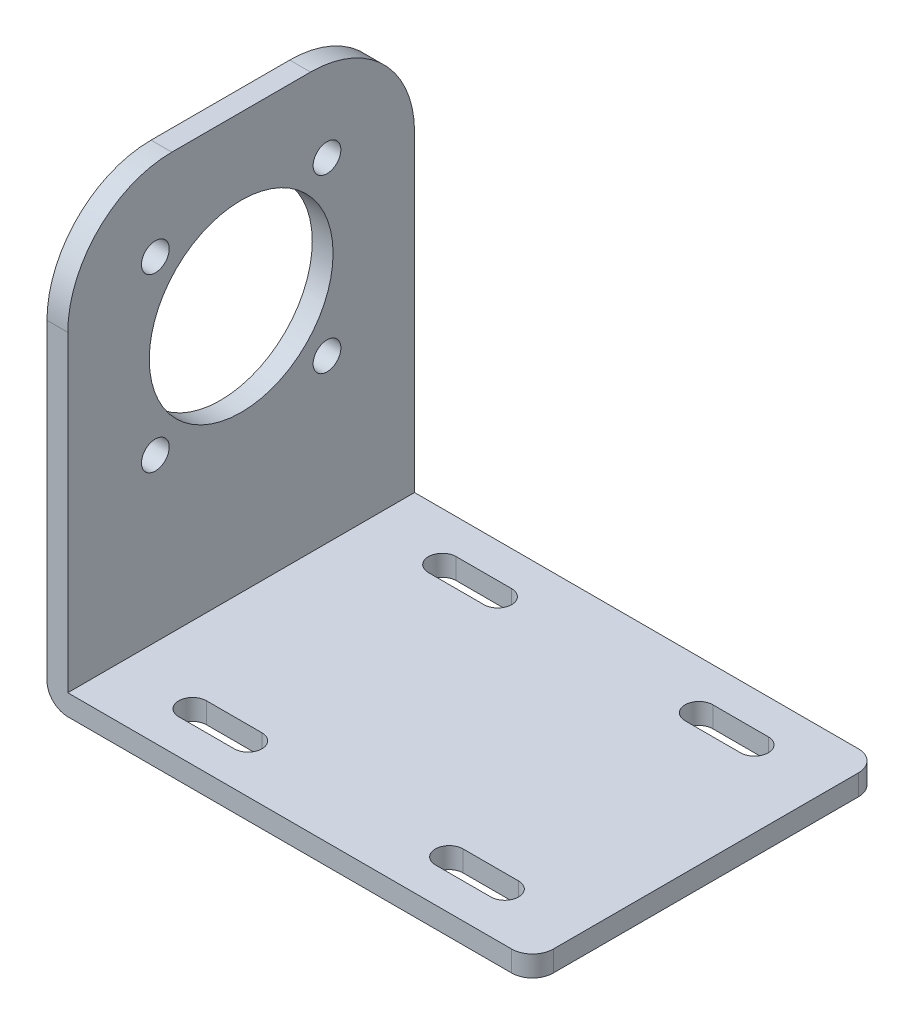
ISO-10303-21;
HEADER;
FILE_DESCRIPTION(('STEP AP214'),'2;1');
FILE_NAME('part.step','',(''),(''),'','','');
FILE_SCHEMA(('AUTOMOTIVE_DESIGN { 1 0 10303 214 1 1 1 1 }'));
ENDSEC;
DATA;
#1=APPLICATION_CONTEXT('core data for automotive mechanical design processes');
#2=APPLICATION_PROTOCOL_DEFINITION('international standard','automotive_design',2000,#1);
#3=PRODUCT_CONTEXT('',#1,'mechanical');
#4=PRODUCT('Part','Part','',(#3));
#5=PRODUCT_RELATED_PRODUCT_CATEGORY('part','',(#4));
#6=PRODUCT_DEFINITION_FORMATION('','',#4);
#7=PRODUCT_DEFINITION_CONTEXT('part definition',#1,'design');
#8=PRODUCT_DEFINITION('design','',#6,#7);
#9=PRODUCT_DEFINITION_SHAPE('','',#8);
#10=(LENGTH_UNIT() NAMED_UNIT(*) SI_UNIT(.MILLI.,.METRE.));
#11=(NAMED_UNIT(*) PLANE_ANGLE_UNIT() SI_UNIT($,.RADIAN.));
#12=(NAMED_UNIT(*) SI_UNIT($,.STERADIAN.) SOLID_ANGLE_UNIT());
#13=UNCERTAINTY_MEASURE_WITH_UNIT(LENGTH_MEASURE(1.E-05),#10,'distance_accuracy_value','');
#14=(GEOMETRIC_REPRESENTATION_CONTEXT(3) GLOBAL_UNCERTAINTY_ASSIGNED_CONTEXT((#13)) GLOBAL_UNIT_ASSIGNED_CONTEXT((#10,
#11,#12)) REPRESENTATION_CONTEXT('',''));
#15=CARTESIAN_POINT('',(0.,0.,0.));
#16=DIRECTION('',(0.,0.,1.));
#17=DIRECTION('',(1.,0.,0.));
#18=AXIS2_PLACEMENT_3D('',#15,#16,#17);
#19=CARTESIAN_POINT('',(0.,3.,0.));
#20=DIRECTION('',(0.,-1.,0.));
#21=DIRECTION('',(0.,0.,-1.));
#22=AXIS2_PLACEMENT_3D('',#19,#20,#21);
#23=PLANE('',#22);
#24=CARTESIAN_POINT('',(14.,3.,-6.99999999999999));
#25=DIRECTION('',(0.,1.,0.));
#26=DIRECTION('',(0.,0.,-1.));
#27=AXIS2_PLACEMENT_3D('',#24,#25,#26);
#28=CIRCLE('',#27,2.00000000000001);
#29=CARTESIAN_POINT('',(14.,3.,-9.));
#30=VERTEX_POINT('',#29);
#31=CARTESIAN_POINT('',(14.,3.,-4.99999999999998));
#32=VERTEX_POINT('',#31);
#33=EDGE_CURVE('E290',#30,#32,#28,.T.);
#34=ORIENTED_EDGE('',*,*,#33,.F.);
#35=DIRECTION('',(-1.,0.,0.));
#36=VECTOR('',#35,1.);
#37=CARTESIAN_POINT('',(14.,3.,-9.));
#38=LINE('',#37,#36);
#39=CARTESIAN_POINT('',(22.,3.,-8.99999999999999));
#40=VERTEX_POINT('',#39);
#41=EDGE_CURVE('E301',#40,#30,#38,.T.);
#42=ORIENTED_EDGE('',*,*,#41,.F.);
#43=CARTESIAN_POINT('',(22.,3.,-6.99999999999999));
#44=DIRECTION('',(0.,1.,0.));
#45=DIRECTION('',(0.,0.,-1.));
#46=AXIS2_PLACEMENT_3D('',#43,#44,#45);
#47=CIRCLE('',#46,1.99999999999999);
#48=CARTESIAN_POINT('',(22.,3.,-5.));
#49=VERTEX_POINT('',#48);
#50=EDGE_CURVE('E297',#49,#40,#47,.T.);
#51=ORIENTED_EDGE('',*,*,#50,.F.);
#52=DIRECTION('',(1.,0.,0.));
#53=VECTOR('',#52,1.);
#54=CARTESIAN_POINT('',(14.,3.,-4.99999999999998));
#55=LINE('',#54,#53);
#56=EDGE_CURVE('E293',#32,#49,#55,.T.);
#57=ORIENTED_EDGE('',*,*,#56,.F.);
#58=EDGE_LOOP('',(#34,#42,#51,#57));
#59=FACE_BOUND('',#58,.T.);
#60=CARTESIAN_POINT('',(51.,3.,-43.));
#61=DIRECTION('',(0.,1.,0.));
#62=DIRECTION('',(0.,0.,1.));
#63=AXIS2_PLACEMENT_3D('',#60,#61,#62);
#64=CIRCLE('',#63,1.99999999999999);
#65=CARTESIAN_POINT('',(51.,3.,-45.));
#66=VERTEX_POINT('',#65);
#67=CARTESIAN_POINT('',(51.,3.,-41.));
#68=VERTEX_POINT('',#67);
#69=EDGE_CURVE('E376',#66,#68,#64,.T.);
#70=ORIENTED_EDGE('',*,*,#69,.F.);
#71=DIRECTION('',(-1.,0.,0.));
#72=VECTOR('',#71,1.);
#73=CARTESIAN_POINT('',(51.,3.,-45.));
#74=LINE('',#73,#72);
#75=CARTESIAN_POINT('',(59.,3.,-45.));
#76=VERTEX_POINT('',#75);
#77=EDGE_CURVE('E387',#76,#66,#74,.T.);
#78=ORIENTED_EDGE('',*,*,#77,.F.);
#79=CARTESIAN_POINT('',(59.,3.,-43.));
#80=DIRECTION('',(0.,1.,0.));
#81=DIRECTION('',(0.,0.,1.));
#82=AXIS2_PLACEMENT_3D('',#79,#80,#81);
#83=CIRCLE('',#82,2.00000000000001);
#84=CARTESIAN_POINT('',(59.,3.,-41.));
#85=VERTEX_POINT('',#84);
#86=EDGE_CURVE('E383',#85,#76,#83,.T.);
#87=ORIENTED_EDGE('',*,*,#86,.F.);
#88=DIRECTION('',(1.,0.,0.));
#89=VECTOR('',#88,1.);
#90=CARTESIAN_POINT('',(51.,3.,-41.));
#91=LINE('',#90,#89);
#92=EDGE_CURVE('E379',#68,#85,#91,.T.);
#93=ORIENTED_EDGE('',*,*,#92,.F.);
#94=EDGE_LOOP('',(#70,#78,#87,#93));
#95=FACE_BOUND('',#94,.T.);
#96=CARTESIAN_POINT('',(14.,3.,-43.));
#97=DIRECTION('',(0.,1.,0.));
#98=DIRECTION('',(0.,0.,1.));
#99=AXIS2_PLACEMENT_3D('',#96,#97,#98);
#100=CIRCLE('',#99,2.00000000000001);
#101=CARTESIAN_POINT('',(14.,3.,-45.));
#102=VERTEX_POINT('',#101);
#103=CARTESIAN_POINT('',(14.,3.,-41.));
#104=VERTEX_POINT('',#103);
#105=EDGE_CURVE('E419',#102,#104,#100,.T.);
#106=ORIENTED_EDGE('',*,*,#105,.F.);
#107=DIRECTION('',(-1.,0.,0.));
#108=VECTOR('',#107,1.);
#109=CARTESIAN_POINT('',(14.,3.,-45.));
#110=LINE('',#109,#108);
#111=CARTESIAN_POINT('',(22.,3.,-45.));
#112=VERTEX_POINT('',#111);
#113=EDGE_CURVE('E430',#112,#102,#110,.T.);
#114=ORIENTED_EDGE('',*,*,#113,.F.);
#115=CARTESIAN_POINT('',(22.,3.,-43.));
#116=DIRECTION('',(0.,1.,0.));
#117=DIRECTION('',(0.,0.,1.));
#118=AXIS2_PLACEMENT_3D('',#115,#116,#117);
#119=CIRCLE('',#118,1.99999999999999);
#120=CARTESIAN_POINT('',(22.,3.,-41.));
#121=VERTEX_POINT('',#120);
#122=EDGE_CURVE('E426',#121,#112,#119,.T.);
#123=ORIENTED_EDGE('',*,*,#122,.F.);
#124=DIRECTION('',(1.,0.,0.));
#125=VECTOR('',#124,1.);
#126=CARTESIAN_POINT('',(14.,3.,-41.));
#127=LINE('',#126,#125);
#128=EDGE_CURVE('E422',#104,#121,#127,.T.);
#129=ORIENTED_EDGE('',*,*,#128,.F.);
#130=EDGE_LOOP('',(#106,#114,#123,#129));
#131=FACE_BOUND('',#130,.T.);
#132=CARTESIAN_POINT('',(51.,3.,-6.99999999999999));
#133=DIRECTION('',(0.,1.,0.));
#134=DIRECTION('',(0.,0.,-1.));
#135=AXIS2_PLACEMENT_3D('',#132,#133,#134);
#136=CIRCLE('',#135,1.99999999999999);
#137=CARTESIAN_POINT('',(51.,3.,-8.99999999999999));
#138=VERTEX_POINT('',#137);
#139=CARTESIAN_POINT('',(51.,3.,-5.));
#140=VERTEX_POINT('',#139);
#141=EDGE_CURVE('E333',#138,#140,#136,.T.);
#142=ORIENTED_EDGE('',*,*,#141,.F.);
#143=DIRECTION('',(-1.,0.,0.));
#144=VECTOR('',#143,1.);
#145=CARTESIAN_POINT('',(51.,3.,-8.99999999999999));
#146=LINE('',#145,#144);
#147=CARTESIAN_POINT('',(59.,3.,-9.));
#148=VERTEX_POINT('',#147);
#149=EDGE_CURVE('E344',#148,#138,#146,.T.);
#150=ORIENTED_EDGE('',*,*,#149,.F.);
#151=CARTESIAN_POINT('',(59.,3.,-6.99999999999999));
#152=DIRECTION('',(0.,1.,0.));
#153=DIRECTION('',(0.,0.,-1.));
#154=AXIS2_PLACEMENT_3D('',#151,#152,#153);
#155=CIRCLE('',#154,2.00000000000001);
#156=CARTESIAN_POINT('',(59.,3.,-4.99999999999998));
#157=VERTEX_POINT('',#156);
#158=EDGE_CURVE('E340',#157,#148,#155,.T.);
#159=ORIENTED_EDGE('',*,*,#158,.F.);
#160=DIRECTION('',(1.,0.,0.));
#161=VECTOR('',#160,1.);
#162=CARTESIAN_POINT('',(51.,3.,-5.));
#163=LINE('',#162,#161);
#164=EDGE_CURVE('E336',#140,#157,#163,.T.);
#165=ORIENTED_EDGE('',*,*,#164,.F.);
#166=EDGE_LOOP('',(#142,#150,#159,#165));
#167=FACE_BOUND('',#166,.T.);
#168=DIRECTION('',(1.,0.,0.));
#169=VECTOR('',#168,1.);
#170=CARTESIAN_POINT('',(0.,3.,0.));
#171=LINE('',#170,#169);
#172=CARTESIAN_POINT('',(3.,3.,0.));
#173=VERTEX_POINT('',#172);
#174=CARTESIAN_POINT('',(67.,3.,0.));
#175=VERTEX_POINT('',#174);
#176=EDGE_CURVE('E462',#173,#175,#171,.T.);
#177=ORIENTED_EDGE('',*,*,#176,.T.);
#178=CARTESIAN_POINT('',(67.,3.,-3.));
#179=DIRECTION('',(0.,-1.,0.));
#180=DIRECTION('',(0.,0.,-1.));
#181=AXIS2_PLACEMENT_3D('',#178,#179,#180);
#182=CIRCLE('',#181,3.);
#183=CARTESIAN_POINT('',(70.,3.,-3.));
#184=VERTEX_POINT('',#183);
#185=EDGE_CURVE('E12',#175,#184,#182,.F.);
#186=ORIENTED_EDGE('',*,*,#185,.T.);
#187=DIRECTION('',(0.,0.,-1.));
#188=VECTOR('',#187,1.);
#189=CARTESIAN_POINT('',(70.,3.,0.));
#190=LINE('',#189,#188);
#191=CARTESIAN_POINT('',(70.,3.,-47.));
#192=VERTEX_POINT('',#191);
#193=EDGE_CURVE('E257',#184,#192,#190,.T.);
#194=ORIENTED_EDGE('',*,*,#193,.T.);
#195=CARTESIAN_POINT('',(67.,3.,-47.));
#196=DIRECTION('',(0.,-1.,0.));
#197=DIRECTION('',(0.,0.,-1.));
#198=AXIS2_PLACEMENT_3D('',#195,#196,#197);
#199=CIRCLE('',#198,3.);
#200=CARTESIAN_POINT('',(67.,3.,-50.));
#201=VERTEX_POINT('',#200);
#202=EDGE_CURVE('E76',#192,#201,#199,.F.);
#203=ORIENTED_EDGE('',*,*,#202,.T.);
#204=DIRECTION('',(-1.,0.,0.));
#205=VECTOR('',#204,1.);
#206=CARTESIAN_POINT('',(0.,3.,-50.));
#207=LINE('',#206,#205);
#208=CARTESIAN_POINT('',(3.,3.,-50.));
#209=VERTEX_POINT('',#208);
#210=EDGE_CURVE('E246',#201,#209,#207,.T.);
#211=ORIENTED_EDGE('',*,*,#210,.T.);
#212=DIRECTION('',(0.,0.,-1.));
#213=VECTOR('',#212,1.);
#214=CARTESIAN_POINT('',(3.,3.,-50.));
#215=LINE('',#214,#213);
#216=EDGE_CURVE('E249',#173,#209,#215,.T.);
#217=ORIENTED_EDGE('',*,*,#216,.F.);
#218=EDGE_LOOP('',(#177,#186,#194,#203,#211,#217));
#219=FACE_BOUND('',#218,.T.);
#220=ADVANCED_FACE('F67',(#59,#95,#131,#167,#219),#23,.F.);
#221=CARTESIAN_POINT('',(0.,0.,0.));
#222=DIRECTION('',(0.,-1.,0.));
#223=DIRECTION('',(0.,0.,-1.));
#224=AXIS2_PLACEMENT_3D('',#221,#222,#223);
#225=PLANE('',#224);
#226=DIRECTION('',(1.,0.,0.));
#227=VECTOR('',#226,1.);
#228=CARTESIAN_POINT('',(0.,0.,0.));
#229=LINE('',#228,#227);
#230=CARTESIAN_POINT('',(3.,0.,0.));
#231=VERTEX_POINT('',#230);
#232=CARTESIAN_POINT('',(67.,0.,0.));
#233=VERTEX_POINT('',#232);
#234=EDGE_CURVE('E461',#231,#233,#229,.T.);
#235=ORIENTED_EDGE('',*,*,#234,.F.);
#236=DIRECTION('',(0.,0.,1.));
#237=VECTOR('',#236,1.);
#238=CARTESIAN_POINT('',(3.,0.,-50.));
#239=LINE('',#238,#237);
#240=CARTESIAN_POINT('',(3.,0.,-50.));
#241=VERTEX_POINT('',#240);
#242=EDGE_CURVE('E540',#231,#241,#239,.F.);
#243=ORIENTED_EDGE('',*,*,#242,.T.);
#244=DIRECTION('',(-1.,0.,0.));
#245=VECTOR('',#244,1.);
#246=CARTESIAN_POINT('',(0.,0.,-50.));
#247=LINE('',#246,#245);
#248=CARTESIAN_POINT('',(67.,0.,-50.));
#249=VERTEX_POINT('',#248);
#250=EDGE_CURVE('E465',#249,#241,#247,.T.);
#251=ORIENTED_EDGE('',*,*,#250,.F.);
#252=CARTESIAN_POINT('',(67.,0.,-47.));
#253=DIRECTION('',(0.,-1.,0.));
#254=DIRECTION('',(0.,0.,-1.));
#255=AXIS2_PLACEMENT_3D('',#252,#253,#254);
#256=CIRCLE('',#255,3.);
#257=CARTESIAN_POINT('',(70.,0.,-47.));
#258=VERTEX_POINT('',#257);
#259=EDGE_CURVE('E534',#249,#258,#256,.T.);
#260=ORIENTED_EDGE('',*,*,#259,.T.);
#261=DIRECTION('',(0.,0.,-1.));
#262=VECTOR('',#261,1.);
#263=CARTESIAN_POINT('',(70.,0.,0.));
#264=LINE('',#263,#262);
#265=CARTESIAN_POINT('',(70.,0.,-3.));
#266=VERTEX_POINT('',#265);
#267=EDGE_CURVE('E471',#266,#258,#264,.T.);
#268=ORIENTED_EDGE('',*,*,#267,.F.);
#269=CARTESIAN_POINT('',(67.,0.,-3.));
#270=DIRECTION('',(0.,-1.,0.));
#271=DIRECTION('',(0.,0.,-1.));
#272=AXIS2_PLACEMENT_3D('',#269,#270,#271);
#273=CIRCLE('',#272,3.);
#274=EDGE_CURVE('E537',#266,#233,#273,.T.);
#275=ORIENTED_EDGE('',*,*,#274,.T.);
#276=EDGE_LOOP('',(#235,#243,#251,#260,#268,#275));
#277=FACE_BOUND('',#276,.T.);
#278=DIRECTION('',(-1.,0.,0.));
#279=VECTOR('',#278,1.);
#280=CARTESIAN_POINT('',(14.,0.,-45.));
#281=LINE('',#280,#279);
#282=CARTESIAN_POINT('',(22.,0.,-45.));
#283=VERTEX_POINT('',#282);
#284=CARTESIAN_POINT('',(14.,0.,-45.));
#285=VERTEX_POINT('',#284);
#286=EDGE_CURVE('E423',#283,#285,#281,.T.);
#287=ORIENTED_EDGE('',*,*,#286,.T.);
#288=CARTESIAN_POINT('',(14.,0.,-43.));
#289=DIRECTION('',(0.,1.,0.));
#290=DIRECTION('',(0.,0.,1.));
#291=AXIS2_PLACEMENT_3D('',#288,#289,#290);
#292=CIRCLE('',#291,2.00000000000001);
#293=CARTESIAN_POINT('',(14.,0.,-41.));
#294=VERTEX_POINT('',#293);
#295=EDGE_CURVE('E418',#285,#294,#292,.T.);
#296=ORIENTED_EDGE('',*,*,#295,.T.);
#297=DIRECTION('',(1.,0.,0.));
#298=VECTOR('',#297,1.);
#299=CARTESIAN_POINT('',(14.,0.,-41.));
#300=LINE('',#299,#298);
#301=CARTESIAN_POINT('',(22.,0.,-41.));
#302=VERTEX_POINT('',#301);
#303=EDGE_CURVE('E437',#294,#302,#300,.T.);
#304=ORIENTED_EDGE('',*,*,#303,.T.);
#305=CARTESIAN_POINT('',(22.,0.,-43.));
#306=DIRECTION('',(0.,1.,0.));
#307=DIRECTION('',(0.,0.,1.));
#308=AXIS2_PLACEMENT_3D('',#305,#306,#307);
#309=CIRCLE('',#308,1.99999999999999);
#310=EDGE_CURVE('E441',#302,#283,#309,.T.);
#311=ORIENTED_EDGE('',*,*,#310,.T.);
#312=EDGE_LOOP('',(#287,#296,#304,#311));
#313=FACE_BOUND('',#312,.T.);
#314=DIRECTION('',(-1.,0.,0.));
#315=VECTOR('',#314,1.);
#316=CARTESIAN_POINT('',(51.,0.,-45.));
#317=LINE('',#316,#315);
#318=CARTESIAN_POINT('',(59.,0.,-45.));
#319=VERTEX_POINT('',#318);
#320=CARTESIAN_POINT('',(51.,0.,-45.));
#321=VERTEX_POINT('',#320);
#322=EDGE_CURVE('E380',#319,#321,#317,.T.);
#323=ORIENTED_EDGE('',*,*,#322,.T.);
#324=CARTESIAN_POINT('',(51.,0.,-43.));
#325=DIRECTION('',(0.,1.,0.));
#326=DIRECTION('',(0.,0.,1.));
#327=AXIS2_PLACEMENT_3D('',#324,#325,#326);
#328=CIRCLE('',#327,1.99999999999999);
#329=CARTESIAN_POINT('',(51.,0.,-41.));
#330=VERTEX_POINT('',#329);
#331=EDGE_CURVE('E375',#321,#330,#328,.T.);
#332=ORIENTED_EDGE('',*,*,#331,.T.);
#333=DIRECTION('',(1.,0.,0.));
#334=VECTOR('',#333,1.);
#335=CARTESIAN_POINT('',(51.,0.,-41.));
#336=LINE('',#335,#334);
#337=CARTESIAN_POINT('',(59.,0.,-41.));
#338=VERTEX_POINT('',#337);
#339=EDGE_CURVE('E394',#330,#338,#336,.T.);
#340=ORIENTED_EDGE('',*,*,#339,.T.);
#341=CARTESIAN_POINT('',(59.,0.,-43.));
#342=DIRECTION('',(0.,1.,0.));
#343=DIRECTION('',(0.,0.,1.));
#344=AXIS2_PLACEMENT_3D('',#341,#342,#343);
#345=CIRCLE('',#344,2.00000000000001);
#346=EDGE_CURVE('E398',#338,#319,#345,.T.);
#347=ORIENTED_EDGE('',*,*,#346,.T.);
#348=EDGE_LOOP('',(#323,#332,#340,#347));
#349=FACE_BOUND('',#348,.T.);
#350=DIRECTION('',(-1.,0.,0.));
#351=VECTOR('',#350,1.);
#352=CARTESIAN_POINT('',(51.,0.,-8.99999999999999));
#353=LINE('',#352,#351);
#354=CARTESIAN_POINT('',(59.,0.,-9.));
#355=VERTEX_POINT('',#354);
#356=CARTESIAN_POINT('',(51.,0.,-8.99999999999999));
#357=VERTEX_POINT('',#356);
#358=EDGE_CURVE('E337',#355,#357,#353,.T.);
#359=ORIENTED_EDGE('',*,*,#358,.T.);
#360=CARTESIAN_POINT('',(51.,0.,-6.99999999999999));
#361=DIRECTION('',(0.,1.,0.));
#362=DIRECTION('',(0.,0.,-1.));
#363=AXIS2_PLACEMENT_3D('',#360,#361,#362);
#364=CIRCLE('',#363,1.99999999999999);
#365=CARTESIAN_POINT('',(51.,0.,-5.));
#366=VERTEX_POINT('',#365);
#367=EDGE_CURVE('E332',#357,#366,#364,.T.);
#368=ORIENTED_EDGE('',*,*,#367,.T.);
#369=DIRECTION('',(1.,0.,0.));
#370=VECTOR('',#369,1.);
#371=CARTESIAN_POINT('',(51.,0.,-5.));
#372=LINE('',#371,#370);
#373=CARTESIAN_POINT('',(59.,0.,-4.99999999999998));
#374=VERTEX_POINT('',#373);
#375=EDGE_CURVE('E351',#366,#374,#372,.T.);
#376=ORIENTED_EDGE('',*,*,#375,.T.);
#377=CARTESIAN_POINT('',(59.,0.,-6.99999999999999));
#378=DIRECTION('',(0.,1.,0.));
#379=DIRECTION('',(0.,0.,-1.));
#380=AXIS2_PLACEMENT_3D('',#377,#378,#379);
#381=CIRCLE('',#380,2.00000000000001);
#382=EDGE_CURVE('E355',#374,#355,#381,.T.);
#383=ORIENTED_EDGE('',*,*,#382,.T.);
#384=EDGE_LOOP('',(#359,#368,#376,#383));
#385=FACE_BOUND('',#384,.T.);
#386=DIRECTION('',(-1.,0.,0.));
#387=VECTOR('',#386,1.);
#388=CARTESIAN_POINT('',(14.,0.,-9.));
#389=LINE('',#388,#387);
#390=CARTESIAN_POINT('',(22.,0.,-8.99999999999999));
#391=VERTEX_POINT('',#390);
#392=CARTESIAN_POINT('',(14.,0.,-9.));
#393=VERTEX_POINT('',#392);
#394=EDGE_CURVE('E294',#391,#393,#389,.T.);
#395=ORIENTED_EDGE('',*,*,#394,.T.);
#396=CARTESIAN_POINT('',(14.,0.,-6.99999999999999));
#397=DIRECTION('',(0.,1.,0.));
#398=DIRECTION('',(0.,0.,-1.));
#399=AXIS2_PLACEMENT_3D('',#396,#397,#398);
#400=CIRCLE('',#399,2.00000000000001);
#401=CARTESIAN_POINT('',(14.,0.,-4.99999999999998));
#402=VERTEX_POINT('',#401);
#403=EDGE_CURVE('E289',#393,#402,#400,.T.);
#404=ORIENTED_EDGE('',*,*,#403,.T.);
#405=DIRECTION('',(1.,0.,0.));
#406=VECTOR('',#405,1.);
#407=CARTESIAN_POINT('',(14.,0.,-4.99999999999998));
#408=LINE('',#407,#406);
#409=CARTESIAN_POINT('',(22.,0.,-5.));
#410=VERTEX_POINT('',#409);
#411=EDGE_CURVE('E308',#402,#410,#408,.T.);
#412=ORIENTED_EDGE('',*,*,#411,.T.);
#413=CARTESIAN_POINT('',(22.,0.,-6.99999999999999));
#414=DIRECTION('',(0.,1.,0.));
#415=DIRECTION('',(0.,0.,-1.));
#416=AXIS2_PLACEMENT_3D('',#413,#414,#415);
#417=CIRCLE('',#416,1.99999999999999);
#418=EDGE_CURVE('E312',#410,#391,#417,.T.);
#419=ORIENTED_EDGE('',*,*,#418,.T.);
#420=EDGE_LOOP('',(#395,#404,#412,#419));
#421=FACE_BOUND('',#420,.T.);
#422=ADVANCED_FACE('F592',(#277,#313,#349,#385,#421),#225,.T.);
#423=CARTESIAN_POINT('',(0.,3.,0.));
#424=DIRECTION('',(1.,0.,0.));
#425=DIRECTION('',(0.,0.,-1.));
#426=AXIS2_PLACEMENT_3D('',#423,#424,#425);
#427=PLANE('',#426);
#428=CARTESIAN_POINT('',(0.,26.3756313292354,-37.3743686707646));
#429=DIRECTION('',(-1.,0.,0.));
#430=DIRECTION('',(0.,0.,1.));
#431=AXIS2_PLACEMENT_3D('',#428,#429,#430);
#432=CIRCLE('',#431,1.99999999999923);
#433=CARTESIAN_POINT('',(0.,26.3756313292354,-35.3743686707654));
#434=VERTEX_POINT('',#433);
#435=EDGE_CURVE('E620',#434,#434,#432,.T.);
#436=ORIENTED_EDGE('',*,*,#435,.F.);
#437=EDGE_LOOP('',(#436));
#438=FACE_BOUND('',#437,.T.);
#439=CARTESIAN_POINT('',(0.,51.1243686707644,-37.3743686707643));
#440=DIRECTION('',(-1.,0.,0.));
#441=DIRECTION('',(0.,0.,1.));
#442=AXIS2_PLACEMENT_3D('',#439,#440,#441);
#443=CIRCLE('',#442,2.00000000000001);
#444=CARTESIAN_POINT('',(0.,51.1243686707644,-35.3743686707643));
#445=VERTEX_POINT('',#444);
#446=EDGE_CURVE('E624',#445,#445,#443,.T.);
#447=ORIENTED_EDGE('',*,*,#446,.F.);
#448=EDGE_LOOP('',(#447));
#449=FACE_BOUND('',#448,.T.);
#450=CARTESIAN_POINT('',(0.,51.1243686707649,-12.6256313292352));
#451=DIRECTION('',(-1.,0.,0.));
#452=DIRECTION('',(0.,0.,1.));
#453=AXIS2_PLACEMENT_3D('',#450,#451,#452);
#454=CIRCLE('',#453,2.);
#455=CARTESIAN_POINT('',(0.,51.1243686707649,-10.6256313292352));
#456=VERTEX_POINT('',#455);
#457=EDGE_CURVE('E628',#456,#456,#454,.T.);
#458=ORIENTED_EDGE('',*,*,#457,.F.);
#459=EDGE_LOOP('',(#458));
#460=FACE_BOUND('',#459,.T.);
#461=CARTESIAN_POINT('',(0.,26.3756313292354,-12.6256313292354));
#462=DIRECTION('',(-1.,0.,0.));
#463=DIRECTION('',(0.,0.,1.));
#464=AXIS2_PLACEMENT_3D('',#461,#462,#463);
#465=CIRCLE('',#464,1.99999999999939);
#466=CARTESIAN_POINT('',(0.,26.3756313292354,-10.625631329236));
#467=VERTEX_POINT('',#466);
#468=EDGE_CURVE('E632',#467,#467,#465,.T.);
#469=ORIENTED_EDGE('',*,*,#468,.F.);
#470=EDGE_LOOP('',(#469));
#471=FACE_BOUND('',#470,.T.);
#472=CARTESIAN_POINT('',(0.,38.75,-25.));
#473=DIRECTION('',(-1.,0.,0.));
#474=DIRECTION('',(0.,0.,1.));
#475=AXIS2_PLACEMENT_3D('',#472,#473,#474);
#476=CIRCLE('',#475,13.25);
#477=CARTESIAN_POINT('',(0.,38.75,-11.75));
#478=VERTEX_POINT('',#477);
#479=EDGE_CURVE('E489',#478,#478,#476,.T.);
#480=ORIENTED_EDGE('',*,*,#479,.F.);
#481=EDGE_LOOP('',(#480));
#482=FACE_BOUND('',#481,.T.);
#483=DIRECTION('',(0.,-1.,0.));
#484=VECTOR('',#483,1.);
#485=CARTESIAN_POINT('',(0.,3.,-50.));
#486=LINE('',#485,#484);
#487=CARTESIAN_POINT('',(0.,48.,-50.));
#488=VERTEX_POINT('',#487);
#489=CARTESIAN_POINT('',(0.,3.,-50.));
#490=VERTEX_POINT('',#489);
#491=EDGE_CURVE('E256',#488,#490,#486,.T.);
#492=ORIENTED_EDGE('',*,*,#491,.T.);
#493=DIRECTION('',(0.,0.,1.));
#494=VECTOR('',#493,1.);
#495=CARTESIAN_POINT('',(0.,3.,0.));
#496=LINE('',#495,#494);
#497=CARTESIAN_POINT('',(0.,3.,0.));
#498=VERTEX_POINT('',#497);
#499=EDGE_CURVE('E524',#490,#498,#496,.T.);
#500=ORIENTED_EDGE('',*,*,#499,.T.);
#501=DIRECTION('',(0.,-1.,0.));
#502=VECTOR('',#501,1.);
#503=CARTESIAN_POINT('',(0.,3.,0.));
#504=LINE('',#503,#502);
#505=CARTESIAN_POINT('',(0.,48.,0.));
#506=VERTEX_POINT('',#505);
#507=EDGE_CURVE('E479',#506,#498,#504,.T.);
#508=ORIENTED_EDGE('',*,*,#507,.F.);
#509=CARTESIAN_POINT('',(0.,48.,-15.));
#510=DIRECTION('',(1.,0.,0.));
#511=DIRECTION('',(0.,0.,-1.));
#512=AXIS2_PLACEMENT_3D('',#509,#510,#511);
#513=CIRCLE('',#512,15.);
#514=CARTESIAN_POINT('',(0.,63.,-15.));
#515=VERTEX_POINT('',#514);
#516=EDGE_CURVE('E507',#506,#515,#513,.F.);
#517=ORIENTED_EDGE('',*,*,#516,.T.);
#518=DIRECTION('',(0.,0.,1.));
#519=VECTOR('',#518,1.);
#520=CARTESIAN_POINT('',(0.,63.,-50.));
#521=LINE('',#520,#519);
#522=CARTESIAN_POINT('',(0.,63.,-35.));
#523=VERTEX_POINT('',#522);
#524=EDGE_CURVE('E275',#523,#515,#521,.T.);
#525=ORIENTED_EDGE('',*,*,#524,.F.);
#526=CARTESIAN_POINT('',(0.,48.,-35.));
#527=DIRECTION('',(1.,0.,0.));
#528=DIRECTION('',(0.,0.,-1.));
#529=AXIS2_PLACEMENT_3D('',#526,#527,#528);
#530=CIRCLE('',#529,15.);
#531=EDGE_CURVE('E510',#523,#488,#530,.F.);
#532=ORIENTED_EDGE('',*,*,#531,.T.);
#533=EDGE_LOOP('',(#492,#500,#508,#517,#525,#532));
#534=FACE_BOUND('',#533,.T.);
#535=ADVANCED_FACE('F566',(#438,#449,#460,#471,#482,#534),#427,.F.);
#536=CARTESIAN_POINT('',(0.,3.,0.));
#537=DIRECTION('',(0.,0.,-1.));
#538=DIRECTION('',(-1.,0.,0.));
#539=AXIS2_PLACEMENT_3D('',#536,#537,#538);
#540=PLANE('',#539);
#541=ORIENTED_EDGE('',*,*,#507,.T.);
#542=CARTESIAN_POINT('',(3.,3.,0.));
#543=DIRECTION('',(0.,0.,-1.));
#544=DIRECTION('',(-1.,0.,0.));
#545=AXIS2_PLACEMENT_3D('',#542,#543,#544);
#546=CIRCLE('',#545,3.);
#547=EDGE_CURVE('E531',#498,#231,#546,.F.);
#548=ORIENTED_EDGE('',*,*,#547,.T.);
#549=ORIENTED_EDGE('',*,*,#234,.T.);
#550=DIRECTION('',(0.,-1.,0.));
#551=VECTOR('',#550,1.);
#552=CARTESIAN_POINT('',(67.,3.,0.));
#553=LINE('',#552,#551);
#554=EDGE_CURVE('E528',#233,#175,#553,.F.);
#555=ORIENTED_EDGE('',*,*,#554,.T.);
#556=ORIENTED_EDGE('',*,*,#176,.F.);
#557=DIRECTION('',(0.,-1.,0.));
#558=VECTOR('',#557,1.);
#559=CARTESIAN_POINT('',(3.00000000000001,63.,0.));
#560=LINE('',#559,#558);
#561=CARTESIAN_POINT('',(3.00000000000001,48.,0.));
#562=VERTEX_POINT('',#561);
#563=EDGE_CURVE('E269',#562,#173,#560,.T.);
#564=ORIENTED_EDGE('',*,*,#563,.F.);
#565=DIRECTION('',(1.,0.,0.));
#566=VECTOR('',#565,1.);
#567=CARTESIAN_POINT('',(0.,48.,0.));
#568=LINE('',#567,#566);
#569=EDGE_CURVE('E521',#562,#506,#568,.F.);
#570=ORIENTED_EDGE('',*,*,#569,.T.);
#571=EDGE_LOOP('',(#541,#548,#549,#555,#556,#564,#570));
#572=FACE_BOUND('',#571,.T.);
#573=ADVANCED_FACE('F576',(#572),#540,.F.);
#574=CARTESIAN_POINT('',(70.,3.,0.));
#575=DIRECTION('',(-1.,0.,0.));
#576=DIRECTION('',(0.,0.,1.));
#577=AXIS2_PLACEMENT_3D('',#574,#575,#576);
#578=PLANE('',#577);
#579=ORIENTED_EDGE('',*,*,#193,.F.);
#580=DIRECTION('',(0.,-1.,0.));
#581=VECTOR('',#580,1.);
#582=CARTESIAN_POINT('',(70.,3.,-3.));
#583=LINE('',#582,#581);
#584=EDGE_CURVE('E551',#184,#266,#583,.T.);
#585=ORIENTED_EDGE('',*,*,#584,.T.);
#586=ORIENTED_EDGE('',*,*,#267,.T.);
#587=DIRECTION('',(0.,-1.,0.));
#588=VECTOR('',#587,1.);
#589=CARTESIAN_POINT('',(70.,3.,-47.));
#590=LINE('',#589,#588);
#591=EDGE_CURVE('E83',#258,#192,#590,.F.);
#592=ORIENTED_EDGE('',*,*,#591,.T.);
#593=EDGE_LOOP('',(#579,#585,#586,#592));
#594=FACE_BOUND('',#593,.T.);
#595=ADVANCED_FACE('F608',(#594),#578,.F.);
#596=CARTESIAN_POINT('',(0.,3.,-50.));
#597=DIRECTION('',(0.,0.,1.));
#598=DIRECTION('',(1.,0.,0.));
#599=AXIS2_PLACEMENT_3D('',#596,#597,#598);
#600=PLANE('',#599);
#601=ORIENTED_EDGE('',*,*,#250,.T.);
#602=CARTESIAN_POINT('',(3.,3.,-50.));
#603=DIRECTION('',(0.,0.,1.));
#604=DIRECTION('',(1.,0.,0.));
#605=AXIS2_PLACEMENT_3D('',#602,#603,#604);
#606=CIRCLE('',#605,3.);
#607=EDGE_CURVE('E546',#241,#490,#606,.F.);
#608=ORIENTED_EDGE('',*,*,#607,.T.);
#609=ORIENTED_EDGE('',*,*,#491,.F.);
#610=DIRECTION('',(-1.,0.,0.));
#611=VECTOR('',#610,1.);
#612=CARTESIAN_POINT('',(3.,48.,-50.));
#613=LINE('',#612,#611);
#614=CARTESIAN_POINT('',(3.,48.,-50.));
#615=VERTEX_POINT('',#614);
#616=EDGE_CURVE('E265',#488,#615,#613,.F.);
#617=ORIENTED_EDGE('',*,*,#616,.T.);
#618=DIRECTION('',(0.,-1.,0.));
#619=VECTOR('',#618,1.);
#620=CARTESIAN_POINT('',(3.,63.,-50.));
#621=LINE('',#620,#619);
#622=EDGE_CURVE('E260',#615,#209,#621,.T.);
#623=ORIENTED_EDGE('',*,*,#622,.T.);
#624=ORIENTED_EDGE('',*,*,#210,.F.);
#625=DIRECTION('',(0.,-1.,0.));
#626=VECTOR('',#625,1.);
#627=CARTESIAN_POINT('',(67.,3.,-50.));
#628=LINE('',#627,#626);
#629=EDGE_CURVE('E543',#201,#249,#628,.T.);
#630=ORIENTED_EDGE('',*,*,#629,.T.);
#631=EDGE_LOOP('',(#601,#608,#609,#617,#623,#624,#630));
#632=FACE_BOUND('',#631,.T.);
#633=ADVANCED_FACE('F262',(#632),#600,.F.);
#634=CARTESIAN_POINT('',(14.,3.,-43.));
#635=DIRECTION('',(0.,-1.,0.));
#636=DIRECTION('',(0.,0.,-1.));
#637=AXIS2_PLACEMENT_3D('',#634,#635,#636);
#638=CYLINDRICAL_SURFACE('',#637,2.00000000000001);
#639=ORIENTED_EDGE('',*,*,#295,.F.);
#640=DIRECTION('',(0.,-1.,0.));
#641=VECTOR('',#640,1.);
#642=CARTESIAN_POINT('',(14.,3.,-45.));
#643=LINE('',#642,#641);
#644=EDGE_CURVE('E433',#102,#285,#643,.T.);
#645=ORIENTED_EDGE('',*,*,#644,.F.);
#646=ORIENTED_EDGE('',*,*,#105,.T.);
#647=DIRECTION('',(0.,-1.,0.));
#648=VECTOR('',#647,1.);
#649=CARTESIAN_POINT('',(14.,3.,-41.));
#650=LINE('',#649,#648);
#651=EDGE_CURVE('E457',#104,#294,#650,.T.);
#652=ORIENTED_EDGE('',*,*,#651,.T.);
#653=EDGE_LOOP('',(#639,#645,#646,#652));
#654=FACE_BOUND('',#653,.T.);
#655=ADVANCED_FACE('F603',(#654),#638,.F.);
#656=CARTESIAN_POINT('',(14.,3.,-41.));
#657=DIRECTION('',(0.,0.,-1.));
#658=DIRECTION('',(-1.,0.,0.));
#659=AXIS2_PLACEMENT_3D('',#656,#657,#658);
#660=PLANE('',#659);
#661=ORIENTED_EDGE('',*,*,#303,.F.);
#662=ORIENTED_EDGE('',*,*,#651,.F.);
#663=ORIENTED_EDGE('',*,*,#128,.T.);
#664=DIRECTION('',(0.,-1.,0.));
#665=VECTOR('',#664,1.);
#666=CARTESIAN_POINT('',(22.,3.,-41.));
#667=LINE('',#666,#665);
#668=EDGE_CURVE('E454',#121,#302,#667,.T.);
#669=ORIENTED_EDGE('',*,*,#668,.T.);
#670=EDGE_LOOP('',(#661,#662,#663,#669));
#671=FACE_BOUND('',#670,.T.);
#672=ADVANCED_FACE('F730',(#671),#660,.T.);
#673=CARTESIAN_POINT('',(22.,3.,-43.));
#674=DIRECTION('',(0.,-1.,0.));
#675=DIRECTION('',(0.,0.,-1.));
#676=AXIS2_PLACEMENT_3D('',#673,#674,#675);
#677=CYLINDRICAL_SURFACE('',#676,1.99999999999999);
#678=ORIENTED_EDGE('',*,*,#310,.F.);
#679=ORIENTED_EDGE('',*,*,#668,.F.);
#680=ORIENTED_EDGE('',*,*,#122,.T.);
#681=DIRECTION('',(0.,-1.,0.));
#682=VECTOR('',#681,1.);
#683=CARTESIAN_POINT('',(22.,3.,-45.));
#684=LINE('',#683,#682);
#685=EDGE_CURVE('E451',#112,#283,#684,.T.);
#686=ORIENTED_EDGE('',*,*,#685,.T.);
#687=EDGE_LOOP('',(#678,#679,#680,#686));
#688=FACE_BOUND('',#687,.T.);
#689=ADVANCED_FACE('F727',(#688),#677,.F.);
#690=CARTESIAN_POINT('',(14.,3.,-45.));
#691=DIRECTION('',(0.,0.,1.));
#692=DIRECTION('',(1.,0.,0.));
#693=AXIS2_PLACEMENT_3D('',#690,#691,#692);
#694=PLANE('',#693);
#695=ORIENTED_EDGE('',*,*,#286,.F.);
#696=ORIENTED_EDGE('',*,*,#685,.F.);
#697=ORIENTED_EDGE('',*,*,#113,.T.);
#698=ORIENTED_EDGE('',*,*,#644,.T.);
#699=EDGE_LOOP('',(#695,#696,#697,#698));
#700=FACE_BOUND('',#699,.T.);
#701=ADVANCED_FACE('F723',(#700),#694,.T.);
#702=CARTESIAN_POINT('',(51.,3.,-43.));
#703=DIRECTION('',(0.,-1.,0.));
#704=DIRECTION('',(0.,0.,-1.));
#705=AXIS2_PLACEMENT_3D('',#702,#703,#704);
#706=CYLINDRICAL_SURFACE('',#705,1.99999999999999);
#707=ORIENTED_EDGE('',*,*,#331,.F.);
#708=DIRECTION('',(0.,-1.,0.));
#709=VECTOR('',#708,1.);
#710=CARTESIAN_POINT('',(51.,3.,-45.));
#711=LINE('',#710,#709);
#712=EDGE_CURVE('E390',#66,#321,#711,.T.);
#713=ORIENTED_EDGE('',*,*,#712,.F.);
#714=ORIENTED_EDGE('',*,*,#69,.T.);
#715=DIRECTION('',(0.,-1.,0.));
#716=VECTOR('',#715,1.);
#717=CARTESIAN_POINT('',(51.,3.,-41.));
#718=LINE('',#717,#716);
#719=EDGE_CURVE('E414',#68,#330,#718,.T.);
#720=ORIENTED_EDGE('',*,*,#719,.T.);
#721=EDGE_LOOP('',(#707,#713,#714,#720));
#722=FACE_BOUND('',#721,.T.);
#723=ADVANCED_FACE('F719',(#722),#706,.F.);
#724=CARTESIAN_POINT('',(51.,3.,-41.));
#725=DIRECTION('',(0.,0.,-1.));
#726=DIRECTION('',(-1.,0.,0.));
#727=AXIS2_PLACEMENT_3D('',#724,#725,#726);
#728=PLANE('',#727);
#729=ORIENTED_EDGE('',*,*,#339,.F.);
#730=ORIENTED_EDGE('',*,*,#719,.F.);
#731=ORIENTED_EDGE('',*,*,#92,.T.);
#732=DIRECTION('',(0.,-1.,0.));
#733=VECTOR('',#732,1.);
#734=CARTESIAN_POINT('',(59.,3.,-41.));
#735=LINE('',#734,#733);
#736=EDGE_CURVE('E411',#85,#338,#735,.T.);
#737=ORIENTED_EDGE('',*,*,#736,.T.);
#738=EDGE_LOOP('',(#729,#730,#731,#737));
#739=FACE_BOUND('',#738,.T.);
#740=ADVANCED_FACE('F715',(#739),#728,.T.);
#741=CARTESIAN_POINT('',(59.,3.,-43.));
#742=DIRECTION('',(0.,-1.,0.));
#743=DIRECTION('',(0.,0.,-1.));
#744=AXIS2_PLACEMENT_3D('',#741,#742,#743);
#745=CYLINDRICAL_SURFACE('',#744,2.00000000000001);
#746=ORIENTED_EDGE('',*,*,#346,.F.);
#747=ORIENTED_EDGE('',*,*,#736,.F.);
#748=ORIENTED_EDGE('',*,*,#86,.T.);
#749=DIRECTION('',(0.,-1.,0.));
#750=VECTOR('',#749,1.);
#751=CARTESIAN_POINT('',(59.,3.,-45.));
#752=LINE('',#751,#750);
#753=EDGE_CURVE('E408',#76,#319,#752,.T.);
#754=ORIENTED_EDGE('',*,*,#753,.T.);
#755=EDGE_LOOP('',(#746,#747,#748,#754));
#756=FACE_BOUND('',#755,.T.);
#757=ADVANCED_FACE('F711',(#756),#745,.F.);
#758=CARTESIAN_POINT('',(51.,3.,-45.));
#759=DIRECTION('',(0.,0.,1.));
#760=DIRECTION('',(1.,0.,0.));
#761=AXIS2_PLACEMENT_3D('',#758,#759,#760);
#762=PLANE('',#761);
#763=ORIENTED_EDGE('',*,*,#322,.F.);
#764=ORIENTED_EDGE('',*,*,#753,.F.);
#765=ORIENTED_EDGE('',*,*,#77,.T.);
#766=ORIENTED_EDGE('',*,*,#712,.T.);
#767=EDGE_LOOP('',(#763,#764,#765,#766));
#768=FACE_BOUND('',#767,.T.);
#769=ADVANCED_FACE('F707',(#768),#762,.T.);
#770=CARTESIAN_POINT('',(51.,3.,-6.99999999999999));
#771=DIRECTION('',(0.,-1.,0.));
#772=DIRECTION('',(0.,0.,-1.));
#773=AXIS2_PLACEMENT_3D('',#770,#771,#772);
#774=CYLINDRICAL_SURFACE('',#773,1.99999999999999);
#775=ORIENTED_EDGE('',*,*,#367,.F.);
#776=DIRECTION('',(0.,-1.,0.));
#777=VECTOR('',#776,1.);
#778=CARTESIAN_POINT('',(51.,3.,-8.99999999999999));
#779=LINE('',#778,#777);
#780=EDGE_CURVE('E347',#138,#357,#779,.T.);
#781=ORIENTED_EDGE('',*,*,#780,.F.);
#782=ORIENTED_EDGE('',*,*,#141,.T.);
#783=DIRECTION('',(0.,-1.,0.));
#784=VECTOR('',#783,1.);
#785=CARTESIAN_POINT('',(51.,3.,-5.));
#786=LINE('',#785,#784);
#787=EDGE_CURVE('E371',#140,#366,#786,.T.);
#788=ORIENTED_EDGE('',*,*,#787,.T.);
#789=EDGE_LOOP('',(#775,#781,#782,#788));
#790=FACE_BOUND('',#789,.T.);
#791=ADVANCED_FACE('F703',(#790),#774,.F.);
#792=CARTESIAN_POINT('',(51.,3.,-5.));
#793=DIRECTION('',(0.,0.,-1.));
#794=DIRECTION('',(-1.,0.,0.));
#795=AXIS2_PLACEMENT_3D('',#792,#793,#794);
#796=PLANE('',#795);
#797=ORIENTED_EDGE('',*,*,#375,.F.);
#798=ORIENTED_EDGE('',*,*,#787,.F.);
#799=ORIENTED_EDGE('',*,*,#164,.T.);
#800=DIRECTION('',(0.,-1.,0.));
#801=VECTOR('',#800,1.);
#802=CARTESIAN_POINT('',(59.,3.,-4.99999999999998));
#803=LINE('',#802,#801);
#804=EDGE_CURVE('E368',#157,#374,#803,.T.);
#805=ORIENTED_EDGE('',*,*,#804,.T.);
#806=EDGE_LOOP('',(#797,#798,#799,#805));
#807=FACE_BOUND('',#806,.T.);
#808=ADVANCED_FACE('F699',(#807),#796,.T.);
#809=CARTESIAN_POINT('',(59.,3.,-6.99999999999999));
#810=DIRECTION('',(0.,-1.,0.));
#811=DIRECTION('',(0.,0.,-1.));
#812=AXIS2_PLACEMENT_3D('',#809,#810,#811);
#813=CYLINDRICAL_SURFACE('',#812,2.00000000000001);
#814=ORIENTED_EDGE('',*,*,#382,.F.);
#815=ORIENTED_EDGE('',*,*,#804,.F.);
#816=ORIENTED_EDGE('',*,*,#158,.T.);
#817=DIRECTION('',(0.,-1.,0.));
#818=VECTOR('',#817,1.);
#819=CARTESIAN_POINT('',(59.,3.,-9.));
#820=LINE('',#819,#818);
#821=EDGE_CURVE('E365',#148,#355,#820,.T.);
#822=ORIENTED_EDGE('',*,*,#821,.T.);
#823=EDGE_LOOP('',(#814,#815,#816,#822));
#824=FACE_BOUND('',#823,.T.);
#825=ADVANCED_FACE('F695',(#824),#813,.F.);
#826=CARTESIAN_POINT('',(51.,3.,-8.99999999999999));
#827=DIRECTION('',(0.,0.,1.));
#828=DIRECTION('',(1.,0.,0.));
#829=AXIS2_PLACEMENT_3D('',#826,#827,#828);
#830=PLANE('',#829);
#831=ORIENTED_EDGE('',*,*,#358,.F.);
#832=ORIENTED_EDGE('',*,*,#821,.F.);
#833=ORIENTED_EDGE('',*,*,#149,.T.);
#834=ORIENTED_EDGE('',*,*,#780,.T.);
#835=EDGE_LOOP('',(#831,#832,#833,#834));
#836=FACE_BOUND('',#835,.T.);
#837=ADVANCED_FACE('F691',(#836),#830,.T.);
#838=CARTESIAN_POINT('',(14.,3.,-6.99999999999999));
#839=DIRECTION('',(0.,-1.,0.));
#840=DIRECTION('',(0.,0.,-1.));
#841=AXIS2_PLACEMENT_3D('',#838,#839,#840);
#842=CYLINDRICAL_SURFACE('',#841,2.00000000000001);
#843=ORIENTED_EDGE('',*,*,#403,.F.);
#844=DIRECTION('',(0.,-1.,0.));
#845=VECTOR('',#844,1.);
#846=CARTESIAN_POINT('',(14.,3.,-9.));
#847=LINE('',#846,#845);
#848=EDGE_CURVE('E304',#30,#393,#847,.T.);
#849=ORIENTED_EDGE('',*,*,#848,.F.);
#850=ORIENTED_EDGE('',*,*,#33,.T.);
#851=DIRECTION('',(0.,-1.,0.));
#852=VECTOR('',#851,1.);
#853=CARTESIAN_POINT('',(14.,3.,-4.99999999999998));
#854=LINE('',#853,#852);
#855=EDGE_CURVE('E328',#32,#402,#854,.T.);
#856=ORIENTED_EDGE('',*,*,#855,.T.);
#857=EDGE_LOOP('',(#843,#849,#850,#856));
#858=FACE_BOUND('',#857,.T.);
#859=ADVANCED_FACE('F687',(#858),#842,.F.);
#860=CARTESIAN_POINT('',(14.,3.,-4.99999999999998));
#861=DIRECTION('',(0.,0.,-1.));
#862=DIRECTION('',(-1.,0.,0.));
#863=AXIS2_PLACEMENT_3D('',#860,#861,#862);
#864=PLANE('',#863);
#865=ORIENTED_EDGE('',*,*,#411,.F.);
#866=ORIENTED_EDGE('',*,*,#855,.F.);
#867=ORIENTED_EDGE('',*,*,#56,.T.);
#868=DIRECTION('',(0.,-1.,0.));
#869=VECTOR('',#868,1.);
#870=CARTESIAN_POINT('',(22.,3.,-5.));
#871=LINE('',#870,#869);
#872=EDGE_CURVE('E325',#49,#410,#871,.T.);
#873=ORIENTED_EDGE('',*,*,#872,.T.);
#874=EDGE_LOOP('',(#865,#866,#867,#873));
#875=FACE_BOUND('',#874,.T.);
#876=ADVANCED_FACE('F683',(#875),#864,.T.);
#877=CARTESIAN_POINT('',(22.,3.,-6.99999999999999));
#878=DIRECTION('',(0.,-1.,0.));
#879=DIRECTION('',(0.,0.,-1.));
#880=AXIS2_PLACEMENT_3D('',#877,#878,#879);
#881=CYLINDRICAL_SURFACE('',#880,1.99999999999999);
#882=ORIENTED_EDGE('',*,*,#418,.F.);
#883=ORIENTED_EDGE('',*,*,#872,.F.);
#884=ORIENTED_EDGE('',*,*,#50,.T.);
#885=DIRECTION('',(0.,-1.,0.));
#886=VECTOR('',#885,1.);
#887=CARTESIAN_POINT('',(22.,3.,-8.99999999999999));
#888=LINE('',#887,#886);
#889=EDGE_CURVE('E322',#40,#391,#888,.T.);
#890=ORIENTED_EDGE('',*,*,#889,.T.);
#891=EDGE_LOOP('',(#882,#883,#884,#890));
#892=FACE_BOUND('',#891,.T.);
#893=ADVANCED_FACE('F679',(#892),#881,.F.);
#894=CARTESIAN_POINT('',(14.,3.,-9.));
#895=DIRECTION('',(0.,0.,1.));
#896=DIRECTION('',(1.,0.,0.));
#897=AXIS2_PLACEMENT_3D('',#894,#895,#896);
#898=PLANE('',#897);
#899=ORIENTED_EDGE('',*,*,#394,.F.);
#900=ORIENTED_EDGE('',*,*,#889,.F.);
#901=ORIENTED_EDGE('',*,*,#41,.T.);
#902=ORIENTED_EDGE('',*,*,#848,.T.);
#903=EDGE_LOOP('',(#899,#900,#901,#902));
#904=FACE_BOUND('',#903,.T.);
#905=ADVANCED_FACE('F657',(#904),#898,.T.);
#906=CARTESIAN_POINT('',(3.,63.,-50.));
#907=DIRECTION('',(-1.,0.,0.));
#908=DIRECTION('',(0.,0.,1.));
#909=AXIS2_PLACEMENT_3D('',#906,#907,#908);
#910=PLANE('',#909);
#911=CARTESIAN_POINT('',(3.,26.3756313292354,-37.3743686707646));
#912=DIRECTION('',(-1.,0.,0.));
#913=DIRECTION('',(0.,0.,1.));
#914=AXIS2_PLACEMENT_3D('',#911,#912,#913);
#915=CIRCLE('',#914,1.99999999999923);
#916=CARTESIAN_POINT('',(3.,26.3756313292354,-35.3743686707654));
#917=VERTEX_POINT('',#916);
#918=EDGE_CURVE('E276',#917,#917,#915,.T.);
#919=ORIENTED_EDGE('',*,*,#918,.T.);
#920=EDGE_LOOP('',(#919));
#921=FACE_BOUND('',#920,.T.);
#922=CARTESIAN_POINT('',(3.,51.1243686707644,-37.3743686707643));
#923=DIRECTION('',(-1.,0.,0.));
#924=DIRECTION('',(0.,0.,1.));
#925=AXIS2_PLACEMENT_3D('',#922,#923,#924);
#926=CIRCLE('',#925,2.00000000000001);
#927=CARTESIAN_POINT('',(3.,51.1243686707644,-35.3743686707643));
#928=VERTEX_POINT('',#927);
#929=EDGE_CURVE('E283',#928,#928,#926,.T.);
#930=ORIENTED_EDGE('',*,*,#929,.T.);
#931=EDGE_LOOP('',(#930));
#932=FACE_BOUND('',#931,.T.);
#933=CARTESIAN_POINT('',(3.00000000000001,51.1243686707649,-12.6256313292352));
#934=DIRECTION('',(-1.,0.,0.));
#935=DIRECTION('',(0.,0.,1.));
#936=AXIS2_PLACEMENT_3D('',#933,#934,#935);
#937=CIRCLE('',#936,2.);
#938=CARTESIAN_POINT('',(3.00000000000001,51.1243686707649,-10.6256313292352));
#939=VERTEX_POINT('',#938);
#940=EDGE_CURVE('E493',#939,#939,#937,.T.);
#941=ORIENTED_EDGE('',*,*,#940,.T.);
#942=EDGE_LOOP('',(#941));
#943=FACE_BOUND('',#942,.T.);
#944=CARTESIAN_POINT('',(3.00000000000001,26.3756313292354,-12.6256313292354));
#945=DIRECTION('',(-1.,0.,0.));
#946=DIRECTION('',(0.,0.,1.));
#947=AXIS2_PLACEMENT_3D('',#944,#945,#946);
#948=CIRCLE('',#947,1.99999999999939);
#949=CARTESIAN_POINT('',(3.00000000000001,26.3756313292354,-10.625631329236));
#950=VERTEX_POINT('',#949);
#951=EDGE_CURVE('E488',#950,#950,#948,.T.);
#952=ORIENTED_EDGE('',*,*,#951,.T.);
#953=EDGE_LOOP('',(#952));
#954=FACE_BOUND('',#953,.T.);
#955=CARTESIAN_POINT('',(3.,38.75,-25.));
#956=DIRECTION('',(-1.,0.,0.));
#957=DIRECTION('',(0.,0.,1.));
#958=AXIS2_PLACEMENT_3D('',#955,#956,#957);
#959=CIRCLE('',#958,13.25);
#960=CARTESIAN_POINT('',(3.,38.75,-11.75));
#961=VERTEX_POINT('',#960);
#962=EDGE_CURVE('E484',#961,#961,#959,.T.);
#963=ORIENTED_EDGE('',*,*,#962,.T.);
#964=EDGE_LOOP('',(#963));
#965=FACE_BOUND('',#964,.T.);
#966=ORIENTED_EDGE('',*,*,#622,.F.);
#967=CARTESIAN_POINT('',(3.,48.,-35.));
#968=DIRECTION('',(-1.,0.,0.));
#969=DIRECTION('',(0.,0.,1.));
#970=AXIS2_PLACEMENT_3D('',#967,#968,#969);
#971=CIRCLE('',#970,15.);
#972=CARTESIAN_POINT('',(3.,63.,-35.));
#973=VERTEX_POINT('',#972);
#974=EDGE_CURVE('E518',#615,#973,#971,.F.);
#975=ORIENTED_EDGE('',*,*,#974,.T.);
#976=DIRECTION('',(0.,0.,-1.));
#977=VECTOR('',#976,1.);
#978=CARTESIAN_POINT('',(3.,63.,-50.));
#979=LINE('',#978,#977);
#980=CARTESIAN_POINT('',(3.,63.,-15.));
#981=VERTEX_POINT('',#980);
#982=EDGE_CURVE('E270',#981,#973,#979,.T.);
#983=ORIENTED_EDGE('',*,*,#982,.F.);
#984=CARTESIAN_POINT('',(3.,48.,-15.));
#985=DIRECTION('',(-1.,0.,0.));
#986=DIRECTION('',(0.,0.,1.));
#987=AXIS2_PLACEMENT_3D('',#984,#985,#986);
#988=CIRCLE('',#987,15.);
#989=EDGE_CURVE('E515',#981,#562,#988,.F.);
#990=ORIENTED_EDGE('',*,*,#989,.T.);
#991=ORIENTED_EDGE('',*,*,#563,.T.);
#992=ORIENTED_EDGE('',*,*,#216,.T.);
#993=EDGE_LOOP('',(#966,#975,#983,#990,#991,#992));
#994=FACE_BOUND('',#993,.T.);
#995=ADVANCED_FACE('F272',(#921,#932,#943,#954,#965,#994),#910,.F.);
#996=CARTESIAN_POINT('',(0.,63.,0.));
#997=DIRECTION('',(0.,1.,0.));
#998=DIRECTION('',(0.,0.,1.));
#999=AXIS2_PLACEMENT_3D('',#996,#997,#998);
#1000=PLANE('',#999);
#1001=ORIENTED_EDGE('',*,*,#982,.T.);
#1002=DIRECTION('',(-1.,0.,0.));
#1003=VECTOR('',#1002,1.);
#1004=CARTESIAN_POINT('',(0.,63.,-35.));
#1005=LINE('',#1004,#1003);
#1006=EDGE_CURVE('E503',#973,#523,#1005,.T.);
#1007=ORIENTED_EDGE('',*,*,#1006,.T.);
#1008=ORIENTED_EDGE('',*,*,#524,.T.);
#1009=DIRECTION('',(1.,0.,0.));
#1010=VECTOR('',#1009,1.);
#1011=CARTESIAN_POINT('',(3.00000000000001,63.,-15.));
#1012=LINE('',#1011,#1010);
#1013=EDGE_CURVE('E483',#515,#981,#1012,.T.);
#1014=ORIENTED_EDGE('',*,*,#1013,.T.);
#1015=EDGE_LOOP('',(#1001,#1007,#1008,#1014));
#1016=FACE_BOUND('',#1015,.T.);
#1017=ADVANCED_FACE('F560',(#1016),#1000,.T.);
#1018=CARTESIAN_POINT('',(60.,38.75,-25.));
#1019=DIRECTION('',(-1.,0.,0.));
#1020=DIRECTION('',(0.,0.,1.));
#1021=AXIS2_PLACEMENT_3D('',#1018,#1019,#1020);
#1022=CYLINDRICAL_SURFACE('',#1021,13.25);
#1023=ORIENTED_EDGE('',*,*,#479,.T.);
#1024=EDGE_LOOP('',(#1023));
#1025=FACE_BOUND('',#1024,.T.);
#1026=ORIENTED_EDGE('',*,*,#962,.F.);
#1027=EDGE_LOOP('',(#1026));
#1028=FACE_BOUND('',#1027,.T.);
#1029=ADVANCED_FACE('F664',(#1025,#1028),#1022,.F.);
#1030=CARTESIAN_POINT('',(60.,26.3756313292354,-12.6256313292354));
#1031=DIRECTION('',(-1.,0.,0.));
#1032=DIRECTION('',(0.,0.,1.));
#1033=AXIS2_PLACEMENT_3D('',#1030,#1031,#1032);
#1034=CYLINDRICAL_SURFACE('',#1033,1.99999999999939);
#1035=ORIENTED_EDGE('',*,*,#468,.T.);
#1036=EDGE_LOOP('',(#1035));
#1037=FACE_BOUND('',#1036,.T.);
#1038=ORIENTED_EDGE('',*,*,#951,.F.);
#1039=EDGE_LOOP('',(#1038));
#1040=FACE_BOUND('',#1039,.T.);
#1041=ADVANCED_FACE('F651',(#1037,#1040),#1034,.F.);
#1042=CARTESIAN_POINT('',(60.,51.1243686707649,-12.6256313292352));
#1043=DIRECTION('',(-1.,0.,0.));
#1044=DIRECTION('',(0.,0.,1.));
#1045=AXIS2_PLACEMENT_3D('',#1042,#1043,#1044);
#1046=CYLINDRICAL_SURFACE('',#1045,2.);
#1047=ORIENTED_EDGE('',*,*,#457,.T.);
#1048=EDGE_LOOP('',(#1047));
#1049=FACE_BOUND('',#1048,.T.);
#1050=ORIENTED_EDGE('',*,*,#940,.F.);
#1051=EDGE_LOOP('',(#1050));
#1052=FACE_BOUND('',#1051,.T.);
#1053=ADVANCED_FACE('F647',(#1049,#1052),#1046,.F.);
#1054=CARTESIAN_POINT('',(60.,51.1243686707644,-37.3743686707643));
#1055=DIRECTION('',(-1.,0.,0.));
#1056=DIRECTION('',(0.,0.,1.));
#1057=AXIS2_PLACEMENT_3D('',#1054,#1055,#1056);
#1058=CYLINDRICAL_SURFACE('',#1057,2.00000000000001);
#1059=ORIENTED_EDGE('',*,*,#446,.T.);
#1060=EDGE_LOOP('',(#1059));
#1061=FACE_BOUND('',#1060,.T.);
#1062=ORIENTED_EDGE('',*,*,#929,.F.);
#1063=EDGE_LOOP('',(#1062));
#1064=FACE_BOUND('',#1063,.T.);
#1065=ADVANCED_FACE('F650',(#1061,#1064),#1058,.F.);
#1066=CARTESIAN_POINT('',(60.,26.3756313292354,-37.3743686707646));
#1067=DIRECTION('',(-1.,0.,0.));
#1068=DIRECTION('',(0.,0.,1.));
#1069=AXIS2_PLACEMENT_3D('',#1066,#1067,#1068);
#1070=CYLINDRICAL_SURFACE('',#1069,1.99999999999923);
#1071=ORIENTED_EDGE('',*,*,#435,.T.);
#1072=EDGE_LOOP('',(#1071));
#1073=FACE_BOUND('',#1072,.T.);
#1074=ORIENTED_EDGE('',*,*,#918,.F.);
#1075=EDGE_LOOP('',(#1074));
#1076=FACE_BOUND('',#1075,.T.);
#1077=ADVANCED_FACE('F589',(#1073,#1076),#1070,.F.);
#1078=CARTESIAN_POINT('',(0.,48.,-35.));
#1079=DIRECTION('',(1.,0.,0.));
#1080=DIRECTION('',(0.,0.,-1.));
#1081=AXIS2_PLACEMENT_3D('',#1078,#1079,#1080);
#1082=CYLINDRICAL_SURFACE('',#1081,15.);
#1083=ORIENTED_EDGE('',*,*,#974,.F.);
#1084=ORIENTED_EDGE('',*,*,#616,.F.);
#1085=ORIENTED_EDGE('',*,*,#531,.F.);
#1086=ORIENTED_EDGE('',*,*,#1006,.F.);
#1087=EDGE_LOOP('',(#1083,#1084,#1085,#1086));
#1088=FACE_BOUND('',#1087,.T.);
#1089=ADVANCED_FACE('F564',(#1088),#1082,.T.);
#1090=CARTESIAN_POINT('',(0.,48.,-15.));
#1091=DIRECTION('',(-1.,0.,0.));
#1092=DIRECTION('',(0.,0.,1.));
#1093=AXIS2_PLACEMENT_3D('',#1090,#1091,#1092);
#1094=CYLINDRICAL_SURFACE('',#1093,15.);
#1095=ORIENTED_EDGE('',*,*,#516,.F.);
#1096=ORIENTED_EDGE('',*,*,#569,.F.);
#1097=ORIENTED_EDGE('',*,*,#989,.F.);
#1098=ORIENTED_EDGE('',*,*,#1013,.F.);
#1099=EDGE_LOOP('',(#1095,#1096,#1097,#1098));
#1100=FACE_BOUND('',#1099,.T.);
#1101=ADVANCED_FACE('F580',(#1100),#1094,.T.);
#1102=CARTESIAN_POINT('',(3.,3.,0.));
#1103=DIRECTION('',(0.,0.,-1.));
#1104=DIRECTION('',(-1.,0.,0.));
#1105=AXIS2_PLACEMENT_3D('',#1102,#1103,#1104);
#1106=CYLINDRICAL_SURFACE('',#1105,3.);
#1107=ORIENTED_EDGE('',*,*,#607,.F.);
#1108=ORIENTED_EDGE('',*,*,#242,.F.);
#1109=ORIENTED_EDGE('',*,*,#547,.F.);
#1110=ORIENTED_EDGE('',*,*,#499,.F.);
#1111=EDGE_LOOP('',(#1107,#1108,#1109,#1110));
#1112=FACE_BOUND('',#1111,.T.);
#1113=ADVANCED_FACE('F572',(#1112),#1106,.T.);
#1114=CARTESIAN_POINT('',(67.,3.,-3.));
#1115=DIRECTION('',(0.,-1.,0.));
#1116=DIRECTION('',(0.,0.,-1.));
#1117=AXIS2_PLACEMENT_3D('',#1114,#1115,#1116);
#1118=CYLINDRICAL_SURFACE('',#1117,3.);
#1119=ORIENTED_EDGE('',*,*,#185,.F.);
#1120=ORIENTED_EDGE('',*,*,#554,.F.);
#1121=ORIENTED_EDGE('',*,*,#274,.F.);
#1122=ORIENTED_EDGE('',*,*,#584,.F.);
#1123=EDGE_LOOP('',(#1119,#1120,#1121,#1122));
#1124=FACE_BOUND('',#1123,.T.);
#1125=ADVANCED_FACE('F587',(#1124),#1118,.T.);
#1126=CARTESIAN_POINT('',(67.,3.,-47.));
#1127=DIRECTION('',(0.,-1.,0.));
#1128=DIRECTION('',(0.,0.,-1.));
#1129=AXIS2_PLACEMENT_3D('',#1126,#1127,#1128);
#1130=CYLINDRICAL_SURFACE('',#1129,3.);
#1131=ORIENTED_EDGE('',*,*,#202,.F.);
#1132=ORIENTED_EDGE('',*,*,#591,.F.);
#1133=ORIENTED_EDGE('',*,*,#259,.F.);
#1134=ORIENTED_EDGE('',*,*,#629,.F.);
#1135=EDGE_LOOP('',(#1131,#1132,#1133,#1134));
#1136=FACE_BOUND('',#1135,.T.);
#1137=ADVANCED_FACE('F69',(#1136),#1130,.T.);
#1138=CLOSED_SHELL('',(#220,#422,#535,#573,#595,#633,#655,#672,#689,#701,#723,#740,#757,#769,
#791,#808,#825,#837,#859,#876,#893,#905,#995,#1017,#1029,#1041,#1053,#1065,#1077,#1089,#1101,
#1113,#1125,#1137));
#1139=MANIFOLD_SOLID_BREP('B2',#1138);
#1140=ADVANCED_BREP_SHAPE_REPRESENTATION('',(#18,#1139),#14);
#1141=SHAPE_DEFINITION_REPRESENTATION(#9,#1140);
ENDSEC;
END-ISO-10303-21;
